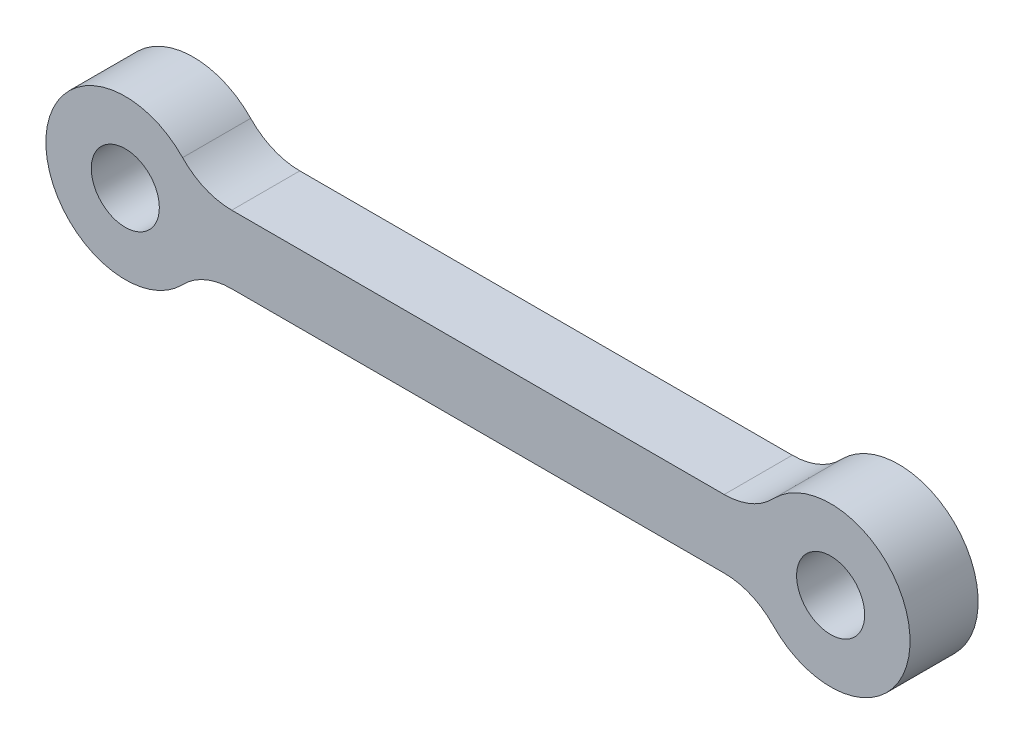
ISO-10303-21;
HEADER;
FILE_DESCRIPTION(('STEP AP214'),'2;1');
FILE_NAME('part.step','',(''),(''),'','','');
FILE_SCHEMA(('AUTOMOTIVE_DESIGN { 1 0 10303 214 1 1 1 1 }'));
ENDSEC;
DATA;
#1=APPLICATION_CONTEXT('core data for automotive mechanical design processes');
#2=APPLICATION_PROTOCOL_DEFINITION('international standard','automotive_design',2000,#1);
#3=PRODUCT_CONTEXT('',#1,'mechanical');
#4=PRODUCT('Part','Part','',(#3));
#5=PRODUCT_RELATED_PRODUCT_CATEGORY('part','',(#4));
#6=PRODUCT_DEFINITION_FORMATION('','',#4);
#7=PRODUCT_DEFINITION_CONTEXT('part definition',#1,'design');
#8=PRODUCT_DEFINITION('design','',#6,#7);
#9=PRODUCT_DEFINITION_SHAPE('','',#8);
#10=(LENGTH_UNIT() NAMED_UNIT(*) SI_UNIT(.MILLI.,.METRE.));
#11=(NAMED_UNIT(*) PLANE_ANGLE_UNIT() SI_UNIT($,.RADIAN.));
#12=(NAMED_UNIT(*) SI_UNIT($,.STERADIAN.) SOLID_ANGLE_UNIT());
#13=UNCERTAINTY_MEASURE_WITH_UNIT(LENGTH_MEASURE(1.E-05),#10,'distance_accuracy_value','');
#14=(GEOMETRIC_REPRESENTATION_CONTEXT(3) GLOBAL_UNCERTAINTY_ASSIGNED_CONTEXT((#13)) GLOBAL_UNIT_ASSIGNED_CONTEXT((#10,
#11,#12)) REPRESENTATION_CONTEXT('',''));
#15=CARTESIAN_POINT('',(0.,0.,0.));
#16=DIRECTION('',(0.,0.,1.));
#17=DIRECTION('',(1.,0.,0.));
#18=AXIS2_PLACEMENT_3D('',#15,#16,#17);
#19=CARTESIAN_POINT('',(26.3895842401766,-4.5,3.));
#20=DIRECTION('',(0.,0.,-1.));
#21=DIRECTION('',(-1.,0.,0.));
#22=AXIS2_PLACEMENT_3D('',#19,#20,#21);
#23=PLANE('',#22);
#24=CARTESIAN_POINT('',(26.3895842401766,-4.5,3.));
#25=DIRECTION('',(0.,0.,-1.));
#26=DIRECTION('',(-1.,0.,0.));
#27=AXIS2_PLACEMENT_3D('',#24,#25,#26);
#28=CIRCLE('',#27,3.);
#29=CARTESIAN_POINT('',(26.3895842401766,-1.5,3.));
#30=VERTEX_POINT('',#29);
#31=CARTESIAN_POINT('',(28.5543915139412,-2.42307692307692,3.));
#32=VERTEX_POINT('',#31);
#33=EDGE_CURVE('E149',#30,#32,#28,.T.);
#34=ORIENTED_EDGE('',*,*,#33,.T.);
#35=CARTESIAN_POINT('',(31.08,0.,3.));
#36=DIRECTION('',(0.,0.,1.));
#37=DIRECTION('',(1.,0.,0.));
#38=AXIS2_PLACEMENT_3D('',#35,#36,#37);
#39=CIRCLE('',#38,3.5);
#40=CARTESIAN_POINT('',(28.5543915139412,2.42307692307692,3.));
#41=VERTEX_POINT('',#40);
#42=EDGE_CURVE('E97',#32,#41,#39,.T.);
#43=ORIENTED_EDGE('',*,*,#42,.T.);
#44=CARTESIAN_POINT('',(26.3895842401766,4.5,3.));
#45=DIRECTION('',(0.,0.,-1.));
#46=DIRECTION('',(1.,0.,0.));
#47=AXIS2_PLACEMENT_3D('',#44,#45,#46);
#48=CIRCLE('',#47,3.);
#49=CARTESIAN_POINT('',(26.3895842401766,1.5,3.));
#50=VERTEX_POINT('',#49);
#51=EDGE_CURVE('E164',#41,#50,#48,.T.);
#52=ORIENTED_EDGE('',*,*,#51,.T.);
#53=DIRECTION('',(-1.,0.,0.));
#54=VECTOR('',#53,1.);
#55=CARTESIAN_POINT('',(4.69041575982343,1.5,3.));
#56=LINE('',#55,#54);
#57=CARTESIAN_POINT('',(4.69041575982343,1.5,3.));
#58=VERTEX_POINT('',#57);
#59=EDGE_CURVE('E177',#50,#58,#56,.T.);
#60=ORIENTED_EDGE('',*,*,#59,.T.);
#61=CARTESIAN_POINT('',(4.69041575982343,4.5,3.));
#62=DIRECTION('',(0.,0.,-1.));
#63=DIRECTION('',(-1.,0.,0.));
#64=AXIS2_PLACEMENT_3D('',#61,#62,#63);
#65=CIRCLE('',#64,3.);
#66=CARTESIAN_POINT('',(2.52560848605877,2.42307692307692,3.));
#67=VERTEX_POINT('',#66);
#68=EDGE_CURVE('E116',#58,#67,#65,.T.);
#69=ORIENTED_EDGE('',*,*,#68,.T.);
#70=CARTESIAN_POINT('',(0.,0.,3.));
#71=DIRECTION('',(0.,0.,1.));
#72=DIRECTION('',(1.,0.,0.));
#73=AXIS2_PLACEMENT_3D('',#70,#71,#72);
#74=CIRCLE('',#73,3.5);
#75=CARTESIAN_POINT('',(2.52560848605877,-2.42307692307692,3.));
#76=VERTEX_POINT('',#75);
#77=EDGE_CURVE('E110',#67,#76,#74,.T.);
#78=ORIENTED_EDGE('',*,*,#77,.T.);
#79=CARTESIAN_POINT('',(4.69041575982343,-4.5,3.));
#80=DIRECTION('',(0.,0.,-1.));
#81=DIRECTION('',(1.,0.,0.));
#82=AXIS2_PLACEMENT_3D('',#79,#80,#81);
#83=CIRCLE('',#82,3.);
#84=CARTESIAN_POINT('',(4.69041575982343,-1.5,3.));
#85=VERTEX_POINT('',#84);
#86=EDGE_CURVE('E114',#76,#85,#83,.T.);
#87=ORIENTED_EDGE('',*,*,#86,.T.);
#88=DIRECTION('',(1.,0.,0.));
#89=VECTOR('',#88,1.);
#90=CARTESIAN_POINT('',(4.69041575982343,-1.5,3.));
#91=LINE('',#90,#89);
#92=EDGE_CURVE('E54',#85,#30,#91,.T.);
#93=ORIENTED_EDGE('',*,*,#92,.T.);
#94=EDGE_LOOP('',(#34,#43,#52,#60,#69,#78,#87,#93));
#95=FACE_BOUND('',#94,.T.);
#96=CARTESIAN_POINT('',(0.,0.,3.));
#97=DIRECTION('',(0.,0.,1.));
#98=DIRECTION('',(1.,0.,0.));
#99=AXIS2_PLACEMENT_3D('',#96,#97,#98);
#100=CIRCLE('',#99,1.5);
#101=CARTESIAN_POINT('',(1.5,0.,3.));
#102=VERTEX_POINT('',#101);
#103=EDGE_CURVE('E138',#102,#102,#100,.T.);
#104=ORIENTED_EDGE('',*,*,#103,.F.);
#105=EDGE_LOOP('',(#104));
#106=FACE_BOUND('',#105,.T.);
#107=CARTESIAN_POINT('',(31.08,0.,3.));
#108=DIRECTION('',(0.,0.,1.));
#109=DIRECTION('',(1.,0.,0.));
#110=AXIS2_PLACEMENT_3D('',#107,#108,#109);
#111=CIRCLE('',#110,1.5);
#112=CARTESIAN_POINT('',(32.58,0.,3.));
#113=VERTEX_POINT('',#112);
#114=EDGE_CURVE('E186',#113,#113,#111,.T.);
#115=ORIENTED_EDGE('',*,*,#114,.F.);
#116=EDGE_LOOP('',(#115));
#117=FACE_BOUND('',#116,.T.);
#118=ADVANCED_FACE('F37',(#95,#106,#117),#23,.F.);
#119=CARTESIAN_POINT('',(26.3895842401766,-4.5,0.));
#120=DIRECTION('',(0.,0.,-1.));
#121=DIRECTION('',(-1.,0.,0.));
#122=AXIS2_PLACEMENT_3D('',#119,#120,#121);
#123=PLANE('',#122);
#124=CARTESIAN_POINT('',(0.,0.,0.));
#125=DIRECTION('',(0.,0.,1.));
#126=DIRECTION('',(1.,0.,0.));
#127=AXIS2_PLACEMENT_3D('',#124,#125,#126);
#128=CIRCLE('',#127,1.5);
#129=CARTESIAN_POINT('',(1.5,0.,0.));
#130=VERTEX_POINT('',#129);
#131=EDGE_CURVE('E183',#130,#130,#128,.T.);
#132=ORIENTED_EDGE('',*,*,#131,.T.);
#133=EDGE_LOOP('',(#132));
#134=FACE_BOUND('',#133,.T.);
#135=CARTESIAN_POINT('',(26.3895842401766,-4.5,0.));
#136=DIRECTION('',(0.,0.,-1.));
#137=DIRECTION('',(-1.,0.,0.));
#138=AXIS2_PLACEMENT_3D('',#135,#136,#137);
#139=CIRCLE('',#138,3.);
#140=CARTESIAN_POINT('',(26.3895842401766,-1.5,0.));
#141=VERTEX_POINT('',#140);
#142=CARTESIAN_POINT('',(28.5543915139412,-2.42307692307692,0.));
#143=VERTEX_POINT('',#142);
#144=EDGE_CURVE('E134',#141,#143,#139,.T.);
#145=ORIENTED_EDGE('',*,*,#144,.F.);
#146=DIRECTION('',(1.,0.,0.));
#147=VECTOR('',#146,1.);
#148=CARTESIAN_POINT('',(4.69041575982343,-1.5,0.));
#149=LINE('',#148,#147);
#150=CARTESIAN_POINT('',(4.69041575982343,-1.5,0.));
#151=VERTEX_POINT('',#150);
#152=EDGE_CURVE('E89',#151,#141,#149,.T.);
#153=ORIENTED_EDGE('',*,*,#152,.F.);
#154=CARTESIAN_POINT('',(4.69041575982343,-4.5,0.));
#155=DIRECTION('',(0.,0.,-1.));
#156=DIRECTION('',(1.,0.,0.));
#157=AXIS2_PLACEMENT_3D('',#154,#155,#156);
#158=CIRCLE('',#157,3.);
#159=CARTESIAN_POINT('',(2.52560848605877,-2.42307692307692,0.));
#160=VERTEX_POINT('',#159);
#161=EDGE_CURVE('E83',#160,#151,#158,.T.);
#162=ORIENTED_EDGE('',*,*,#161,.F.);
#163=CARTESIAN_POINT('',(0.,0.,0.));
#164=DIRECTION('',(0.,0.,1.));
#165=DIRECTION('',(1.,0.,0.));
#166=AXIS2_PLACEMENT_3D('',#163,#164,#165);
#167=CIRCLE('',#166,3.5);
#168=CARTESIAN_POINT('',(2.52560848605877,2.42307692307692,0.));
#169=VERTEX_POINT('',#168);
#170=EDGE_CURVE('E124',#169,#160,#167,.T.);
#171=ORIENTED_EDGE('',*,*,#170,.F.);
#172=CARTESIAN_POINT('',(4.69041575982343,4.5,0.));
#173=DIRECTION('',(0.,0.,-1.));
#174=DIRECTION('',(-1.,0.,0.));
#175=AXIS2_PLACEMENT_3D('',#172,#173,#174);
#176=CIRCLE('',#175,3.);
#177=CARTESIAN_POINT('',(4.69041575982343,1.5,0.));
#178=VERTEX_POINT('',#177);
#179=EDGE_CURVE('E144',#178,#169,#176,.T.);
#180=ORIENTED_EDGE('',*,*,#179,.F.);
#181=DIRECTION('',(-1.,0.,0.));
#182=VECTOR('',#181,1.);
#183=CARTESIAN_POINT('',(4.69041575982343,1.5,0.));
#184=LINE('',#183,#182);
#185=CARTESIAN_POINT('',(26.3895842401766,1.5,0.));
#186=VERTEX_POINT('',#185);
#187=EDGE_CURVE('E142',#186,#178,#184,.T.);
#188=ORIENTED_EDGE('',*,*,#187,.F.);
#189=CARTESIAN_POINT('',(26.3895842401766,4.5,0.));
#190=DIRECTION('',(0.,0.,-1.));
#191=DIRECTION('',(1.,0.,0.));
#192=AXIS2_PLACEMENT_3D('',#189,#190,#191);
#193=CIRCLE('',#192,3.);
#194=CARTESIAN_POINT('',(28.5543915139412,2.42307692307692,0.));
#195=VERTEX_POINT('',#194);
#196=EDGE_CURVE('E140',#195,#186,#193,.T.);
#197=ORIENTED_EDGE('',*,*,#196,.F.);
#198=CARTESIAN_POINT('',(31.08,0.,0.));
#199=DIRECTION('',(0.,0.,1.));
#200=DIRECTION('',(1.,0.,0.));
#201=AXIS2_PLACEMENT_3D('',#198,#199,#200);
#202=CIRCLE('',#201,3.5);
#203=EDGE_CURVE('E137',#143,#195,#202,.T.);
#204=ORIENTED_EDGE('',*,*,#203,.F.);
#205=EDGE_LOOP('',(#145,#153,#162,#171,#180,#188,#197,#204));
#206=FACE_BOUND('',#205,.T.);
#207=CARTESIAN_POINT('',(31.08,0.,0.));
#208=DIRECTION('',(0.,0.,1.));
#209=DIRECTION('',(1.,0.,0.));
#210=AXIS2_PLACEMENT_3D('',#207,#208,#209);
#211=CIRCLE('',#210,1.5);
#212=CARTESIAN_POINT('',(32.58,0.,0.));
#213=VERTEX_POINT('',#212);
#214=EDGE_CURVE('E189',#213,#213,#211,.T.);
#215=ORIENTED_EDGE('',*,*,#214,.T.);
#216=EDGE_LOOP('',(#215));
#217=FACE_BOUND('',#216,.T.);
#218=ADVANCED_FACE('F168',(#134,#206,#217),#123,.T.);
#219=CARTESIAN_POINT('',(26.3895842401766,-4.5,3.));
#220=DIRECTION('',(0.,0.,-1.));
#221=DIRECTION('',(-1.,0.,0.));
#222=AXIS2_PLACEMENT_3D('',#219,#220,#221);
#223=CYLINDRICAL_SURFACE('',#222,3.);
#224=ORIENTED_EDGE('',*,*,#144,.T.);
#225=DIRECTION('',(0.,0.,-1.));
#226=VECTOR('',#225,1.);
#227=CARTESIAN_POINT('',(28.5543915139412,-2.42307692307692,3.));
#228=LINE('',#227,#226);
#229=EDGE_CURVE('E11',#32,#143,#228,.T.);
#230=ORIENTED_EDGE('',*,*,#229,.F.);
#231=ORIENTED_EDGE('',*,*,#33,.F.);
#232=DIRECTION('',(0.,0.,-1.));
#233=VECTOR('',#232,1.);
#234=CARTESIAN_POINT('',(26.3895842401766,-1.5,3.));
#235=LINE('',#234,#233);
#236=EDGE_CURVE('E130',#30,#141,#235,.T.);
#237=ORIENTED_EDGE('',*,*,#236,.T.);
#238=EDGE_LOOP('',(#224,#230,#231,#237));
#239=FACE_BOUND('',#238,.T.);
#240=ADVANCED_FACE('F39',(#239),#223,.F.);
#241=CARTESIAN_POINT('',(31.08,0.,3.));
#242=DIRECTION('',(0.,0.,-1.));
#243=DIRECTION('',(-1.,0.,0.));
#244=AXIS2_PLACEMENT_3D('',#241,#242,#243);
#245=CYLINDRICAL_SURFACE('',#244,3.5);
#246=ORIENTED_EDGE('',*,*,#203,.T.);
#247=DIRECTION('',(0.,0.,-1.));
#248=VECTOR('',#247,1.);
#249=CARTESIAN_POINT('',(28.5543915139412,2.42307692307692,3.));
#250=LINE('',#249,#248);
#251=EDGE_CURVE('E46',#41,#195,#250,.T.);
#252=ORIENTED_EDGE('',*,*,#251,.F.);
#253=ORIENTED_EDGE('',*,*,#42,.F.);
#254=ORIENTED_EDGE('',*,*,#229,.T.);
#255=EDGE_LOOP('',(#246,#252,#253,#254));
#256=FACE_BOUND('',#255,.T.);
#257=ADVANCED_FACE('F221',(#256),#245,.T.);
#258=CARTESIAN_POINT('',(26.3895842401766,4.5,3.));
#259=DIRECTION('',(0.,0.,-1.));
#260=DIRECTION('',(-1.,0.,0.));
#261=AXIS2_PLACEMENT_3D('',#258,#259,#260);
#262=CYLINDRICAL_SURFACE('',#261,3.);
#263=ORIENTED_EDGE('',*,*,#196,.T.);
#264=DIRECTION('',(0.,0.,-1.));
#265=VECTOR('',#264,1.);
#266=CARTESIAN_POINT('',(26.3895842401766,1.5,3.));
#267=LINE('',#266,#265);
#268=EDGE_CURVE('E156',#50,#186,#267,.T.);
#269=ORIENTED_EDGE('',*,*,#268,.F.);
#270=ORIENTED_EDGE('',*,*,#51,.F.);
#271=ORIENTED_EDGE('',*,*,#251,.T.);
#272=EDGE_LOOP('',(#263,#269,#270,#271));
#273=FACE_BOUND('',#272,.T.);
#274=ADVANCED_FACE('F162',(#273),#262,.F.);
#275=CARTESIAN_POINT('',(4.69041575982343,1.5,3.));
#276=DIRECTION('',(0.,-1.,0.));
#277=DIRECTION('',(0.,0.,-1.));
#278=AXIS2_PLACEMENT_3D('',#275,#276,#277);
#279=PLANE('',#278);
#280=ORIENTED_EDGE('',*,*,#187,.T.);
#281=DIRECTION('',(0.,0.,-1.));
#282=VECTOR('',#281,1.);
#283=CARTESIAN_POINT('',(4.69041575982343,1.5,3.));
#284=LINE('',#283,#282);
#285=EDGE_CURVE('E153',#58,#178,#284,.T.);
#286=ORIENTED_EDGE('',*,*,#285,.F.);
#287=ORIENTED_EDGE('',*,*,#59,.F.);
#288=ORIENTED_EDGE('',*,*,#268,.T.);
#289=EDGE_LOOP('',(#280,#286,#287,#288));
#290=FACE_BOUND('',#289,.T.);
#291=ADVANCED_FACE('F173',(#290),#279,.F.);
#292=CARTESIAN_POINT('',(4.69041575982343,4.5,3.));
#293=DIRECTION('',(0.,0.,-1.));
#294=DIRECTION('',(-1.,0.,0.));
#295=AXIS2_PLACEMENT_3D('',#292,#293,#294);
#296=CYLINDRICAL_SURFACE('',#295,3.);
#297=ORIENTED_EDGE('',*,*,#179,.T.);
#298=DIRECTION('',(0.,0.,-1.));
#299=VECTOR('',#298,1.);
#300=CARTESIAN_POINT('',(2.52560848605877,2.42307692307692,3.));
#301=LINE('',#300,#299);
#302=EDGE_CURVE('E125',#67,#169,#301,.T.);
#303=ORIENTED_EDGE('',*,*,#302,.F.);
#304=ORIENTED_EDGE('',*,*,#68,.F.);
#305=ORIENTED_EDGE('',*,*,#285,.T.);
#306=EDGE_LOOP('',(#297,#303,#304,#305));
#307=FACE_BOUND('',#306,.T.);
#308=ADVANCED_FACE('F176',(#307),#296,.F.);
#309=CARTESIAN_POINT('',(0.,0.,3.));
#310=DIRECTION('',(0.,0.,-1.));
#311=DIRECTION('',(-1.,0.,0.));
#312=AXIS2_PLACEMENT_3D('',#309,#310,#311);
#313=CYLINDRICAL_SURFACE('',#312,3.5);
#314=ORIENTED_EDGE('',*,*,#170,.T.);
#315=DIRECTION('',(0.,0.,-1.));
#316=VECTOR('',#315,1.);
#317=CARTESIAN_POINT('',(2.52560848605877,-2.42307692307692,3.));
#318=LINE('',#317,#316);
#319=EDGE_CURVE('E121',#76,#160,#318,.T.);
#320=ORIENTED_EDGE('',*,*,#319,.F.);
#321=ORIENTED_EDGE('',*,*,#77,.F.);
#322=ORIENTED_EDGE('',*,*,#302,.T.);
#323=EDGE_LOOP('',(#314,#320,#321,#322));
#324=FACE_BOUND('',#323,.T.);
#325=ADVANCED_FACE('F122',(#324),#313,.T.);
#326=CARTESIAN_POINT('',(4.69041575982343,-4.5,3.));
#327=DIRECTION('',(0.,0.,-1.));
#328=DIRECTION('',(-1.,0.,0.));
#329=AXIS2_PLACEMENT_3D('',#326,#327,#328);
#330=CYLINDRICAL_SURFACE('',#329,3.);
#331=ORIENTED_EDGE('',*,*,#161,.T.);
#332=DIRECTION('',(0.,0.,-1.));
#333=VECTOR('',#332,1.);
#334=CARTESIAN_POINT('',(4.69041575982343,-1.5,3.));
#335=LINE('',#334,#333);
#336=EDGE_CURVE('E126',#85,#151,#335,.T.);
#337=ORIENTED_EDGE('',*,*,#336,.F.);
#338=ORIENTED_EDGE('',*,*,#86,.F.);
#339=ORIENTED_EDGE('',*,*,#319,.T.);
#340=EDGE_LOOP('',(#331,#337,#338,#339));
#341=FACE_BOUND('',#340,.T.);
#342=ADVANCED_FACE('F128',(#341),#330,.F.);
#343=CARTESIAN_POINT('',(4.69041575982343,-1.5,3.));
#344=DIRECTION('',(0.,1.,0.));
#345=DIRECTION('',(0.,0.,1.));
#346=AXIS2_PLACEMENT_3D('',#343,#344,#345);
#347=PLANE('',#346);
#348=ORIENTED_EDGE('',*,*,#152,.T.);
#349=ORIENTED_EDGE('',*,*,#236,.F.);
#350=ORIENTED_EDGE('',*,*,#92,.F.);
#351=ORIENTED_EDGE('',*,*,#336,.T.);
#352=EDGE_LOOP('',(#348,#349,#350,#351));
#353=FACE_BOUND('',#352,.T.);
#354=ADVANCED_FACE('F209',(#353),#347,.F.);
#355=CARTESIAN_POINT('',(0.,0.,3.));
#356=DIRECTION('',(0.,0.,-1.));
#357=DIRECTION('',(-1.,0.,0.));
#358=AXIS2_PLACEMENT_3D('',#355,#356,#357);
#359=CYLINDRICAL_SURFACE('',#358,1.5);
#360=ORIENTED_EDGE('',*,*,#103,.T.);
#361=EDGE_LOOP('',(#360));
#362=FACE_BOUND('',#361,.T.);
#363=ORIENTED_EDGE('',*,*,#131,.F.);
#364=EDGE_LOOP('',(#363));
#365=FACE_BOUND('',#364,.T.);
#366=ADVANCED_FACE('F206',(#362,#365),#359,.F.);
#367=CARTESIAN_POINT('',(31.08,0.,3.));
#368=DIRECTION('',(0.,0.,-1.));
#369=DIRECTION('',(-1.,0.,0.));
#370=AXIS2_PLACEMENT_3D('',#367,#368,#369);
#371=CYLINDRICAL_SURFACE('',#370,1.5);
#372=ORIENTED_EDGE('',*,*,#114,.T.);
#373=EDGE_LOOP('',(#372));
#374=FACE_BOUND('',#373,.T.);
#375=ORIENTED_EDGE('',*,*,#214,.F.);
#376=EDGE_LOOP('',(#375));
#377=FACE_BOUND('',#376,.T.);
#378=ADVANCED_FACE('F195',(#374,#377),#371,.F.);
#379=CLOSED_SHELL('',(#118,#218,#240,#257,#274,#291,#308,#325,#342,#354,#366,#378));
#380=MANIFOLD_SOLID_BREP('B2',#379);
#381=ADVANCED_BREP_SHAPE_REPRESENTATION('',(#18,#380),#14);
#382=SHAPE_DEFINITION_REPRESENTATION(#9,#381);
ENDSEC;
END-ISO-10303-21;
